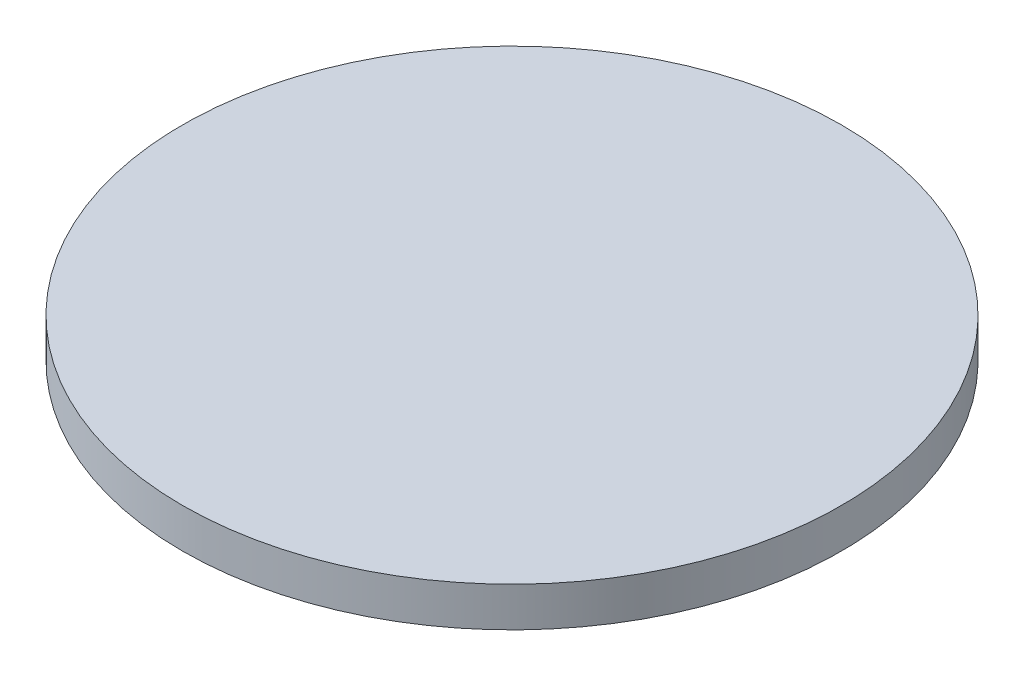
ISO-10303-21;
HEADER;
FILE_DESCRIPTION(('STEP AP214'),'2;1');
FILE_NAME('part.step','',(''),(''),'','','');
FILE_SCHEMA(('AUTOMOTIVE_DESIGN { 1 0 10303 214 1 1 1 1 }'));
ENDSEC;
DATA;
#1=APPLICATION_CONTEXT('core data for automotive mechanical design processes');
#2=APPLICATION_PROTOCOL_DEFINITION('international standard','automotive_design',2000,#1);
#3=PRODUCT_CONTEXT('',#1,'mechanical');
#4=PRODUCT('Part','Part','',(#3));
#5=PRODUCT_RELATED_PRODUCT_CATEGORY('part','',(#4));
#6=PRODUCT_DEFINITION_FORMATION('','',#4);
#7=PRODUCT_DEFINITION_CONTEXT('part definition',#1,'design');
#8=PRODUCT_DEFINITION('design','',#6,#7);
#9=PRODUCT_DEFINITION_SHAPE('','',#8);
#10=(LENGTH_UNIT() NAMED_UNIT(*) SI_UNIT(.MILLI.,.METRE.));
#11=(NAMED_UNIT(*) PLANE_ANGLE_UNIT() SI_UNIT($,.RADIAN.));
#12=(NAMED_UNIT(*) SI_UNIT($,.STERADIAN.) SOLID_ANGLE_UNIT());
#13=UNCERTAINTY_MEASURE_WITH_UNIT(LENGTH_MEASURE(1.E-05),#10,'distance_accuracy_value','');
#14=(GEOMETRIC_REPRESENTATION_CONTEXT(3) GLOBAL_UNCERTAINTY_ASSIGNED_CONTEXT((#13)) GLOBAL_UNIT_ASSIGNED_CONTEXT((#10,
#11,#12)) REPRESENTATION_CONTEXT('',''));
#15=CARTESIAN_POINT('',(0.,0.,0.));
#16=DIRECTION('',(0.,0.,1.));
#17=DIRECTION('',(1.,0.,0.));
#18=AXIS2_PLACEMENT_3D('',#15,#16,#17);
#19=CARTESIAN_POINT('',(0.,15.,0.));
#20=DIRECTION('',(0.,-1.,0.));
#21=DIRECTION('',(0.,0.,-1.));
#22=AXIS2_PLACEMENT_3D('',#19,#20,#21);
#23=CYLINDRICAL_SURFACE('',#22,125.);
#24=CARTESIAN_POINT('',(0.,15.,0.));
#25=DIRECTION('',(0.,1.,0.));
#26=DIRECTION('',(0.,0.,1.));
#27=AXIS2_PLACEMENT_3D('',#24,#25,#26);
#28=CIRCLE('',#27,125.);
#29=CARTESIAN_POINT('',(0.,15.,125.));
#30=VERTEX_POINT('',#29);
#31=EDGE_CURVE('E10',#30,#30,#28,.T.);
#32=ORIENTED_EDGE('',*,*,#31,.F.);
#33=EDGE_LOOP('',(#32));
#34=FACE_BOUND('',#33,.T.);
#35=CARTESIAN_POINT('',(0.,0.,0.));
#36=DIRECTION('',(0.,1.,0.));
#37=DIRECTION('',(0.,0.,1.));
#38=AXIS2_PLACEMENT_3D('',#35,#36,#37);
#39=CIRCLE('',#38,125.);
#40=CARTESIAN_POINT('',(0.,0.,125.));
#41=VERTEX_POINT('',#40);
#42=EDGE_CURVE('E41',#41,#41,#39,.T.);
#43=ORIENTED_EDGE('',*,*,#42,.T.);
#44=EDGE_LOOP('',(#43));
#45=FACE_BOUND('',#44,.T.);
#46=ADVANCED_FACE('F38',(#34,#45),#23,.T.);
#47=CARTESIAN_POINT('',(0.,15.,0.));
#48=DIRECTION('',(0.,1.,0.));
#49=DIRECTION('',(0.,0.,1.));
#50=AXIS2_PLACEMENT_3D('',#47,#48,#49);
#51=PLANE('',#50);
#52=ORIENTED_EDGE('',*,*,#31,.T.);
#53=EDGE_LOOP('',(#52));
#54=FACE_BOUND('',#53,.T.);
#55=ADVANCED_FACE('F55',(#54),#51,.T.);
#56=CARTESIAN_POINT('',(0.,0.,0.));
#57=DIRECTION('',(0.,1.,0.));
#58=DIRECTION('',(0.,0.,1.));
#59=AXIS2_PLACEMENT_3D('',#56,#57,#58);
#60=PLANE('',#59);
#61=ORIENTED_EDGE('',*,*,#42,.F.);
#62=EDGE_LOOP('',(#61));
#63=FACE_BOUND('',#62,.T.);
#64=ADVANCED_FACE('F53',(#63),#60,.F.);
#65=CLOSED_SHELL('',(#46,#55,#64));
#66=MANIFOLD_SOLID_BREP('B2',#65);
#67=ADVANCED_BREP_SHAPE_REPRESENTATION('',(#18,#66),#14);
#68=SHAPE_DEFINITION_REPRESENTATION(#9,#67);
ENDSEC;
END-ISO-10303-21;
